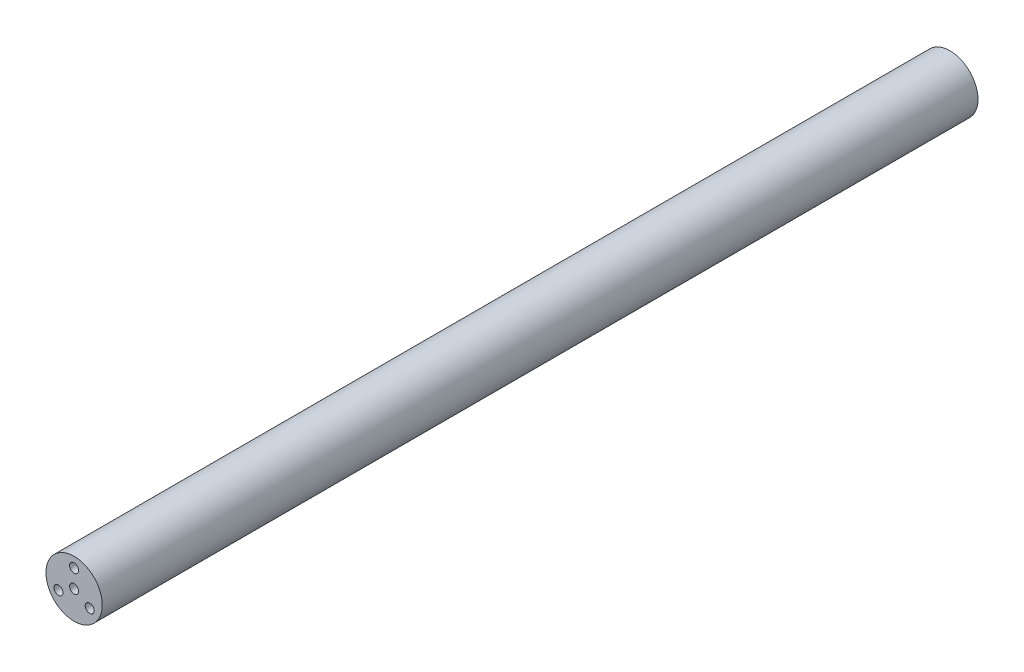
ISO-10303-21;
HEADER;
FILE_DESCRIPTION(('STEP AP214'),'2;1');
FILE_NAME('part.step','',(''),(''),'','','');
FILE_SCHEMA(('AUTOMOTIVE_DESIGN { 1 0 10303 214 1 1 1 1 }'));
ENDSEC;
DATA;
#1=APPLICATION_CONTEXT('core data for automotive mechanical design processes');
#2=APPLICATION_PROTOCOL_DEFINITION('international standard','automotive_design',2000,#1);
#3=PRODUCT_CONTEXT('',#1,'mechanical');
#4=PRODUCT('Part','Part','',(#3));
#5=PRODUCT_RELATED_PRODUCT_CATEGORY('part','',(#4));
#6=PRODUCT_DEFINITION_FORMATION('','',#4);
#7=PRODUCT_DEFINITION_CONTEXT('part definition',#1,'design');
#8=PRODUCT_DEFINITION('design','',#6,#7);
#9=PRODUCT_DEFINITION_SHAPE('','',#8);
#10=(LENGTH_UNIT() NAMED_UNIT(*) SI_UNIT(.MILLI.,.METRE.));
#11=(NAMED_UNIT(*) PLANE_ANGLE_UNIT() SI_UNIT($,.RADIAN.));
#12=(NAMED_UNIT(*) SI_UNIT($,.STERADIAN.) SOLID_ANGLE_UNIT());
#13=UNCERTAINTY_MEASURE_WITH_UNIT(LENGTH_MEASURE(1.E-05),#10,'distance_accuracy_value','');
#14=(GEOMETRIC_REPRESENTATION_CONTEXT(3) GLOBAL_UNCERTAINTY_ASSIGNED_CONTEXT((#13)) GLOBAL_UNIT_ASSIGNED_CONTEXT((#10,
#11,#12)) REPRESENTATION_CONTEXT('',''));
#15=CARTESIAN_POINT('',(0.,0.,0.));
#16=DIRECTION('',(0.,0.,1.));
#17=DIRECTION('',(1.,0.,0.));
#18=AXIS2_PLACEMENT_3D('',#15,#16,#17);
#19=CARTESIAN_POINT('',(-6.92820323027552,-3.99999999999998,-805.5));
#20=DIRECTION('',(0.,0.,1.));
#21=DIRECTION('',(1.,0.,0.));
#22=AXIS2_PLACEMENT_3D('',#19,#20,#21);
#23=CYLINDRICAL_SURFACE('',#22,2.);
#24=CARTESIAN_POINT('',(-6.92820323027552,-3.99999999999998,-194.5));
#25=DIRECTION('',(0.,0.,1.));
#26=DIRECTION('',(1.,0.,0.));
#27=AXIS2_PLACEMENT_3D('',#24,#25,#26);
#28=CIRCLE('',#27,2.);
#29=CARTESIAN_POINT('',(-4.92820323027552,-3.99999999999998,-194.5));
#30=VERTEX_POINT('',#29);
#31=EDGE_CURVE('E207',#30,#30,#28,.T.);
#32=ORIENTED_EDGE('',*,*,#31,.F.);
#33=EDGE_LOOP('',(#32));
#34=FACE_BOUND('',#33,.T.);
#35=CARTESIAN_POINT('',(-6.92820323027552,-3.99999999999998,-146.5));
#36=DIRECTION('',(0.,0.,1.));
#37=DIRECTION('',(1.,0.,0.));
#38=AXIS2_PLACEMENT_3D('',#35,#36,#37);
#39=CIRCLE('',#38,2.);
#40=CARTESIAN_POINT('',(-5.71954013768019,-5.59346588560843,-146.5));
#41=VERTEX_POINT('',#40);
#42=CARTESIAN_POINT('',(-7.70385362097863,-2.15653411439154,-146.5));
#43=VERTEX_POINT('',#42);
#44=EDGE_CURVE('E226',#41,#43,#39,.F.);
#45=ORIENTED_EDGE('',*,*,#44,.F.);
#46=DIRECTION('',(0.,0.,1.));
#47=VECTOR('',#46,1.);
#48=CARTESIAN_POINT('',(-5.71954013768019,-5.59346588560843,-305.5));
#49=LINE('',#48,#47);
#50=CARTESIAN_POINT('',(-5.71954013768019,-5.59346588560843,-154.5));
#51=VERTEX_POINT('',#50);
#52=EDGE_CURVE('E162',#51,#41,#49,.T.);
#53=ORIENTED_EDGE('',*,*,#52,.F.);
#54=CARTESIAN_POINT('',(-6.92820323027552,-3.99999999999998,-154.5));
#55=DIRECTION('',(0.,0.,1.));
#56=DIRECTION('',(1.,0.,0.));
#57=AXIS2_PLACEMENT_3D('',#54,#55,#56);
#58=CIRCLE('',#57,2.);
#59=CARTESIAN_POINT('',(-7.70385362097863,-2.15653411439154,-154.5));
#60=VERTEX_POINT('',#59);
#61=EDGE_CURVE('E213',#51,#60,#58,.T.);
#62=ORIENTED_EDGE('',*,*,#61,.T.);
#63=DIRECTION('',(0.,0.,1.));
#64=VECTOR('',#63,1.);
#65=CARTESIAN_POINT('',(-7.70385362097863,-2.15653411439154,-305.5));
#66=LINE('',#65,#64);
#67=EDGE_CURVE('E169',#43,#60,#66,.F.);
#68=ORIENTED_EDGE('',*,*,#67,.F.);
#69=EDGE_LOOP('',(#45,#53,#62,#68));
#70=FACE_BOUND('',#69,.T.);
#71=ADVANCED_FACE('F40',(#34,#70),#23,.F.);
#72=CARTESIAN_POINT('',(6.92820323027552,-3.99999999999998,-805.5));
#73=DIRECTION('',(0.,0.,1.));
#74=DIRECTION('',(1.,0.,0.));
#75=AXIS2_PLACEMENT_3D('',#72,#73,#74);
#76=CYLINDRICAL_SURFACE('',#75,2.);
#77=CARTESIAN_POINT('',(6.92820323027552,-3.99999999999998,-194.5));
#78=DIRECTION('',(0.,0.,1.));
#79=DIRECTION('',(1.,0.,0.));
#80=AXIS2_PLACEMENT_3D('',#77,#78,#79);
#81=CIRCLE('',#80,2.);
#82=CARTESIAN_POINT('',(8.92820323027552,-3.99999999999998,-194.5));
#83=VERTEX_POINT('',#82);
#84=EDGE_CURVE('E198',#83,#83,#81,.T.);
#85=ORIENTED_EDGE('',*,*,#84,.F.);
#86=EDGE_LOOP('',(#85));
#87=FACE_BOUND('',#86,.T.);
#88=CARTESIAN_POINT('',(6.92820323027552,-3.99999999999998,-146.5));
#89=DIRECTION('',(0.,0.,1.));
#90=DIRECTION('',(1.,0.,0.));
#91=AXIS2_PLACEMENT_3D('',#88,#89,#90);
#92=CIRCLE('',#91,2.);
#93=CARTESIAN_POINT('',(7.70385362097863,-2.15653411439154,-146.5));
#94=VERTEX_POINT('',#93);
#95=CARTESIAN_POINT('',(5.71954013768019,-5.59346588560842,-146.5));
#96=VERTEX_POINT('',#95);
#97=EDGE_CURVE('E63',#94,#96,#92,.F.);
#98=ORIENTED_EDGE('',*,*,#97,.F.);
#99=DIRECTION('',(0.,0.,1.));
#100=VECTOR('',#99,1.);
#101=CARTESIAN_POINT('',(7.70385362097863,-2.15653411439154,-305.5));
#102=LINE('',#101,#100);
#103=CARTESIAN_POINT('',(7.70385362097863,-2.15653411439154,-154.5));
#104=VERTEX_POINT('',#103);
#105=EDGE_CURVE('E154',#104,#94,#102,.T.);
#106=ORIENTED_EDGE('',*,*,#105,.F.);
#107=CARTESIAN_POINT('',(6.92820323027552,-3.99999999999998,-154.5));
#108=DIRECTION('',(0.,0.,1.));
#109=DIRECTION('',(1.,0.,0.));
#110=AXIS2_PLACEMENT_3D('',#107,#108,#109);
#111=CIRCLE('',#110,2.);
#112=CARTESIAN_POINT('',(5.71954013768019,-5.59346588560842,-154.5));
#113=VERTEX_POINT('',#112);
#114=EDGE_CURVE('E204',#104,#113,#111,.T.);
#115=ORIENTED_EDGE('',*,*,#114,.T.);
#116=DIRECTION('',(0.,0.,1.));
#117=VECTOR('',#116,1.);
#118=CARTESIAN_POINT('',(5.7195401376802,-5.59346588560842,-305.5));
#119=LINE('',#118,#117);
#120=EDGE_CURVE('E161',#96,#113,#119,.F.);
#121=ORIENTED_EDGE('',*,*,#120,.F.);
#122=EDGE_LOOP('',(#98,#106,#115,#121));
#123=FACE_BOUND('',#122,.T.);
#124=ADVANCED_FACE('F276',(#87,#123),#76,.F.);
#125=CARTESIAN_POINT('',(0.,8.,-805.5));
#126=DIRECTION('',(0.,0.,1.));
#127=DIRECTION('',(1.,0.,0.));
#128=AXIS2_PLACEMENT_3D('',#125,#126,#127);
#129=CYLINDRICAL_SURFACE('',#128,2.);
#130=CARTESIAN_POINT('',(0.,8.,-194.5));
#131=DIRECTION('',(0.,0.,1.));
#132=DIRECTION('',(1.,0.,0.));
#133=AXIS2_PLACEMENT_3D('',#130,#131,#132);
#134=CIRCLE('',#133,2.);
#135=CARTESIAN_POINT('',(2.,8.,-194.5));
#136=VERTEX_POINT('',#135);
#137=EDGE_CURVE('E190',#136,#136,#134,.T.);
#138=ORIENTED_EDGE('',*,*,#137,.F.);
#139=EDGE_LOOP('',(#138));
#140=FACE_BOUND('',#139,.T.);
#141=CARTESIAN_POINT('',(0.,8.,-146.5));
#142=DIRECTION('',(0.,0.,1.));
#143=DIRECTION('',(1.,0.,0.));
#144=AXIS2_PLACEMENT_3D('',#141,#142,#143);
#145=CIRCLE('',#144,2.);
#146=CARTESIAN_POINT('',(-1.98431348329844,7.75,-146.5));
#147=VERTEX_POINT('',#146);
#148=CARTESIAN_POINT('',(1.98431348329844,7.75,-146.5));
#149=VERTEX_POINT('',#148);
#150=EDGE_CURVE('E56',#147,#149,#145,.F.);
#151=ORIENTED_EDGE('',*,*,#150,.F.);
#152=DIRECTION('',(0.,0.,1.));
#153=VECTOR('',#152,1.);
#154=CARTESIAN_POINT('',(-1.98431348329844,7.75,-305.5));
#155=LINE('',#154,#153);
#156=CARTESIAN_POINT('',(-1.98431348329844,7.75,-154.5));
#157=VERTEX_POINT('',#156);
#158=EDGE_CURVE('E13',#157,#147,#155,.T.);
#159=ORIENTED_EDGE('',*,*,#158,.F.);
#160=CARTESIAN_POINT('',(0.,8.,-154.5));
#161=DIRECTION('',(0.,0.,1.));
#162=DIRECTION('',(1.,0.,0.));
#163=AXIS2_PLACEMENT_3D('',#160,#161,#162);
#164=CIRCLE('',#163,2.);
#165=CARTESIAN_POINT('',(1.98431348329844,7.75,-154.5));
#166=VERTEX_POINT('',#165);
#167=EDGE_CURVE('E195',#157,#166,#164,.T.);
#168=ORIENTED_EDGE('',*,*,#167,.T.);
#169=DIRECTION('',(0.,0.,1.));
#170=VECTOR('',#169,1.);
#171=CARTESIAN_POINT('',(1.98431348329844,7.75,-305.5));
#172=LINE('',#171,#170);
#173=EDGE_CURVE('E152',#149,#166,#172,.F.);
#174=ORIENTED_EDGE('',*,*,#173,.F.);
#175=EDGE_LOOP('',(#151,#159,#168,#174));
#176=FACE_BOUND('',#175,.T.);
#177=ADVANCED_FACE('F282',(#140,#176),#129,.F.);
#178=CARTESIAN_POINT('',(0.,0.,194.5));
#179=DIRECTION('',(0.,0.,-1.));
#180=DIRECTION('',(-1.,0.,0.));
#181=AXIS2_PLACEMENT_3D('',#178,#179,#180);
#182=CYLINDRICAL_SURFACE('',#181,12.5);
#183=CARTESIAN_POINT('',(0.,0.,194.5));
#184=DIRECTION('',(0.,0.,1.));
#185=DIRECTION('',(1.,0.,0.));
#186=AXIS2_PLACEMENT_3D('',#183,#184,#185);
#187=CIRCLE('',#186,12.5);
#188=CARTESIAN_POINT('',(12.5,0.,194.5));
#189=VERTEX_POINT('',#188);
#190=EDGE_CURVE('E172',#189,#189,#187,.T.);
#191=ORIENTED_EDGE('',*,*,#190,.F.);
#192=EDGE_LOOP('',(#191));
#193=FACE_BOUND('',#192,.T.);
#194=CARTESIAN_POINT('',(0.,0.,-194.5));
#195=DIRECTION('',(0.,0.,1.));
#196=DIRECTION('',(1.,0.,0.));
#197=AXIS2_PLACEMENT_3D('',#194,#195,#196);
#198=CIRCLE('',#197,12.5);
#199=CARTESIAN_POINT('',(12.5,0.,-194.5));
#200=VERTEX_POINT('',#199);
#201=EDGE_CURVE('E174',#200,#200,#198,.T.);
#202=ORIENTED_EDGE('',*,*,#201,.T.);
#203=EDGE_LOOP('',(#202));
#204=FACE_BOUND('',#203,.T.);
#205=ADVANCED_FACE('F42',(#193,#204),#182,.T.);
#206=CARTESIAN_POINT('',(0.,0.,194.5));
#207=DIRECTION('',(0.,0.,1.));
#208=DIRECTION('',(1.,0.,0.));
#209=AXIS2_PLACEMENT_3D('',#206,#207,#208);
#210=PLANE('',#209);
#211=CARTESIAN_POINT('',(0.,8.,194.5));
#212=DIRECTION('',(0.,0.,1.));
#213=DIRECTION('',(1.,0.,0.));
#214=AXIS2_PLACEMENT_3D('',#211,#212,#213);
#215=CIRCLE('',#214,2.);
#216=CARTESIAN_POINT('',(2.,8.,194.5));
#217=VERTEX_POINT('',#216);
#218=EDGE_CURVE('E216',#217,#217,#215,.T.);
#219=ORIENTED_EDGE('',*,*,#218,.F.);
#220=EDGE_LOOP('',(#219));
#221=FACE_BOUND('',#220,.T.);
#222=CARTESIAN_POINT('',(0.,0.,194.5));
#223=DIRECTION('',(0.,0.,1.));
#224=DIRECTION('',(1.,0.,0.));
#225=AXIS2_PLACEMENT_3D('',#222,#223,#224);
#226=CIRCLE('',#225,2.);
#227=CARTESIAN_POINT('',(2.,0.,194.5));
#228=VERTEX_POINT('',#227);
#229=EDGE_CURVE('E221',#228,#228,#226,.T.);
#230=ORIENTED_EDGE('',*,*,#229,.F.);
#231=EDGE_LOOP('',(#230));
#232=FACE_BOUND('',#231,.T.);
#233=CARTESIAN_POINT('',(6.92820323027552,-3.99999999999998,194.5));
#234=DIRECTION('',(0.,0.,1.));
#235=DIRECTION('',(1.,0.,0.));
#236=AXIS2_PLACEMENT_3D('',#233,#234,#235);
#237=CIRCLE('',#236,2.);
#238=CARTESIAN_POINT('',(8.92820323027552,-3.99999999999998,194.5));
#239=VERTEX_POINT('',#238);
#240=EDGE_CURVE('E217',#239,#239,#237,.T.);
#241=ORIENTED_EDGE('',*,*,#240,.F.);
#242=EDGE_LOOP('',(#241));
#243=FACE_BOUND('',#242,.T.);
#244=CARTESIAN_POINT('',(-6.92820323027552,-3.99999999999998,194.5));
#245=DIRECTION('',(0.,0.,1.));
#246=DIRECTION('',(1.,0.,0.));
#247=AXIS2_PLACEMENT_3D('',#244,#245,#246);
#248=CIRCLE('',#247,2.);
#249=CARTESIAN_POINT('',(-4.92820323027552,-3.99999999999998,194.5));
#250=VERTEX_POINT('',#249);
#251=EDGE_CURVE('E220',#250,#250,#248,.T.);
#252=ORIENTED_EDGE('',*,*,#251,.F.);
#253=EDGE_LOOP('',(#252));
#254=FACE_BOUND('',#253,.T.);
#255=ORIENTED_EDGE('',*,*,#190,.T.);
#256=EDGE_LOOP('',(#255));
#257=FACE_BOUND('',#256,.T.);
#258=ADVANCED_FACE('F294',(#221,#232,#243,#254,#257),#210,.T.);
#259=CARTESIAN_POINT('',(0.,0.,-194.5));
#260=DIRECTION('',(0.,0.,1.));
#261=DIRECTION('',(1.,0.,0.));
#262=AXIS2_PLACEMENT_3D('',#259,#260,#261);
#263=PLANE('',#262);
#264=ORIENTED_EDGE('',*,*,#137,.T.);
#265=EDGE_LOOP('',(#264));
#266=FACE_BOUND('',#265,.T.);
#267=CARTESIAN_POINT('',(0.,0.,-194.5));
#268=DIRECTION('',(0.,0.,1.));
#269=DIRECTION('',(1.,0.,0.));
#270=AXIS2_PLACEMENT_3D('',#267,#268,#269);
#271=CIRCLE('',#270,2.);
#272=CARTESIAN_POINT('',(2.,0.,-194.5));
#273=VERTEX_POINT('',#272);
#274=EDGE_CURVE('E184',#273,#273,#271,.T.);
#275=ORIENTED_EDGE('',*,*,#274,.T.);
#276=EDGE_LOOP('',(#275));
#277=FACE_BOUND('',#276,.T.);
#278=ORIENTED_EDGE('',*,*,#84,.T.);
#279=EDGE_LOOP('',(#278));
#280=FACE_BOUND('',#279,.T.);
#281=ORIENTED_EDGE('',*,*,#31,.T.);
#282=EDGE_LOOP('',(#281));
#283=FACE_BOUND('',#282,.T.);
#284=ORIENTED_EDGE('',*,*,#201,.F.);
#285=EDGE_LOOP('',(#284));
#286=FACE_BOUND('',#285,.T.);
#287=ADVANCED_FACE('F289',(#266,#277,#280,#283,#286),#263,.F.);
#288=CARTESIAN_POINT('',(-5.71954013768019,-5.59346588560843,146.5));
#289=VERTEX_POINT('',#288);
#290=CARTESIAN_POINT('',(-5.71954013768019,-5.59346588560843,154.5));
#291=VERTEX_POINT('',#290);
#292=EDGE_CURVE('E165',#289,#291,#49,.T.);
#293=ORIENTED_EDGE('',*,*,#292,.F.);
#294=CARTESIAN_POINT('',(-6.92820323027552,-3.99999999999998,146.5));
#295=DIRECTION('',(0.,0.,1.));
#296=DIRECTION('',(1.,0.,0.));
#297=AXIS2_PLACEMENT_3D('',#294,#295,#296);
#298=CIRCLE('',#297,2.);
#299=CARTESIAN_POINT('',(-7.70385362097863,-2.15653411439154,146.5));
#300=VERTEX_POINT('',#299);
#301=EDGE_CURVE('E238',#289,#300,#298,.F.);
#302=ORIENTED_EDGE('',*,*,#301,.T.);
#303=CARTESIAN_POINT('',(-7.70385362097863,-2.15653411439154,154.5));
#304=VERTEX_POINT('',#303);
#305=EDGE_CURVE('E166',#304,#300,#66,.F.);
#306=ORIENTED_EDGE('',*,*,#305,.F.);
#307=CARTESIAN_POINT('',(-6.92820323027552,-3.99999999999998,154.5));
#308=DIRECTION('',(0.,0.,1.));
#309=DIRECTION('',(1.,0.,0.));
#310=AXIS2_PLACEMENT_3D('',#307,#308,#309);
#311=CIRCLE('',#310,2.);
#312=EDGE_CURVE('E210',#291,#304,#311,.T.);
#313=ORIENTED_EDGE('',*,*,#312,.F.);
#314=EDGE_LOOP('',(#293,#302,#306,#313));
#315=FACE_BOUND('',#314,.T.);
#316=ORIENTED_EDGE('',*,*,#251,.T.);
#317=EDGE_LOOP('',(#316));
#318=FACE_BOUND('',#317,.T.);
#319=ADVANCED_FACE('F258',(#315,#318),#23,.F.);
#320=CARTESIAN_POINT('',(7.70385362097863,-2.15653411439154,146.5));
#321=VERTEX_POINT('',#320);
#322=CARTESIAN_POINT('',(7.70385362097863,-2.15653411439154,154.5));
#323=VERTEX_POINT('',#322);
#324=EDGE_CURVE('E157',#321,#323,#102,.T.);
#325=ORIENTED_EDGE('',*,*,#324,.F.);
#326=CARTESIAN_POINT('',(6.92820323027552,-3.99999999999998,146.5));
#327=DIRECTION('',(0.,0.,1.));
#328=DIRECTION('',(1.,0.,0.));
#329=AXIS2_PLACEMENT_3D('',#326,#327,#328);
#330=CIRCLE('',#329,2.);
#331=CARTESIAN_POINT('',(5.71954013768019,-5.59346588560842,146.5));
#332=VERTEX_POINT('',#331);
#333=EDGE_CURVE('E144',#321,#332,#330,.F.);
#334=ORIENTED_EDGE('',*,*,#333,.T.);
#335=CARTESIAN_POINT('',(5.71954013768019,-5.59346588560842,154.5));
#336=VERTEX_POINT('',#335);
#337=EDGE_CURVE('E158',#336,#332,#119,.F.);
#338=ORIENTED_EDGE('',*,*,#337,.F.);
#339=CARTESIAN_POINT('',(6.92820323027552,-3.99999999999998,154.5));
#340=DIRECTION('',(0.,0.,1.));
#341=DIRECTION('',(1.,0.,0.));
#342=AXIS2_PLACEMENT_3D('',#339,#340,#341);
#343=CIRCLE('',#342,2.);
#344=EDGE_CURVE('E201',#323,#336,#343,.T.);
#345=ORIENTED_EDGE('',*,*,#344,.F.);
#346=EDGE_LOOP('',(#325,#334,#338,#345));
#347=FACE_BOUND('',#346,.T.);
#348=ORIENTED_EDGE('',*,*,#240,.T.);
#349=EDGE_LOOP('',(#348));
#350=FACE_BOUND('',#349,.T.);
#351=ADVANCED_FACE('F244',(#347,#350),#76,.F.);
#352=CARTESIAN_POINT('',(-1.98431348329844,7.75,146.5));
#353=VERTEX_POINT('',#352);
#354=CARTESIAN_POINT('',(-1.98431348329844,7.75,154.5));
#355=VERTEX_POINT('',#354);
#356=EDGE_CURVE('E49',#353,#355,#155,.T.);
#357=ORIENTED_EDGE('',*,*,#356,.F.);
#358=CARTESIAN_POINT('',(0.,8.,146.5));
#359=DIRECTION('',(0.,0.,1.));
#360=DIRECTION('',(1.,0.,0.));
#361=AXIS2_PLACEMENT_3D('',#358,#359,#360);
#362=CIRCLE('',#361,2.);
#363=CARTESIAN_POINT('',(1.98431348329844,7.75,146.5));
#364=VERTEX_POINT('',#363);
#365=EDGE_CURVE('E131',#353,#364,#362,.F.);
#366=ORIENTED_EDGE('',*,*,#365,.T.);
#367=CARTESIAN_POINT('',(1.98431348329844,7.75,154.5));
#368=VERTEX_POINT('',#367);
#369=EDGE_CURVE('E142',#368,#364,#172,.F.);
#370=ORIENTED_EDGE('',*,*,#369,.F.);
#371=CARTESIAN_POINT('',(0.,8.,154.5));
#372=DIRECTION('',(0.,0.,1.));
#373=DIRECTION('',(1.,0.,0.));
#374=AXIS2_PLACEMENT_3D('',#371,#372,#373);
#375=CIRCLE('',#374,2.);
#376=EDGE_CURVE('E193',#355,#368,#375,.T.);
#377=ORIENTED_EDGE('',*,*,#376,.F.);
#378=EDGE_LOOP('',(#357,#366,#370,#377));
#379=FACE_BOUND('',#378,.T.);
#380=ORIENTED_EDGE('',*,*,#218,.T.);
#381=EDGE_LOOP('',(#380));
#382=FACE_BOUND('',#381,.T.);
#383=ADVANCED_FACE('F139',(#379,#382),#129,.F.);
#384=CARTESIAN_POINT('',(0.,0.,-805.5));
#385=DIRECTION('',(0.,0.,1.));
#386=DIRECTION('',(1.,0.,0.));
#387=AXIS2_PLACEMENT_3D('',#384,#385,#386);
#388=CYLINDRICAL_SURFACE('',#387,2.);
#389=CARTESIAN_POINT('',(0.,0.,-154.5));
#390=DIRECTION('',(0.,0.,1.));
#391=DIRECTION('',(1.,0.,0.));
#392=AXIS2_PLACEMENT_3D('',#389,#390,#391);
#393=CIRCLE('',#392,2.);
#394=CARTESIAN_POINT('',(2.,0.,-154.5));
#395=VERTEX_POINT('',#394);
#396=EDGE_CURVE('E44',#395,#395,#393,.T.);
#397=ORIENTED_EDGE('',*,*,#396,.T.);
#398=EDGE_LOOP('',(#397));
#399=FACE_BOUND('',#398,.T.);
#400=ORIENTED_EDGE('',*,*,#274,.F.);
#401=EDGE_LOOP('',(#400));
#402=FACE_BOUND('',#401,.T.);
#403=ADVANCED_FACE('F315',(#399,#402),#388,.F.);
#404=ORIENTED_EDGE('',*,*,#229,.T.);
#405=EDGE_LOOP('',(#404));
#406=FACE_BOUND('',#405,.T.);
#407=CARTESIAN_POINT('',(0.,0.,154.5));
#408=DIRECTION('',(0.,0.,1.));
#409=DIRECTION('',(1.,0.,0.));
#410=AXIS2_PLACEMENT_3D('',#407,#408,#409);
#411=CIRCLE('',#410,2.);
#412=CARTESIAN_POINT('',(2.,0.,154.5));
#413=VERTEX_POINT('',#412);
#414=EDGE_CURVE('E187',#413,#413,#411,.T.);
#415=ORIENTED_EDGE('',*,*,#414,.F.);
#416=EDGE_LOOP('',(#415));
#417=FACE_BOUND('',#416,.T.);
#418=ADVANCED_FACE('F310',(#406,#417),#388,.F.);
#419=CARTESIAN_POINT('',(0.,0.,154.5));
#420=DIRECTION('',(0.,0.,1.));
#421=DIRECTION('',(1.,0.,0.));
#422=AXIS2_PLACEMENT_3D('',#419,#420,#421);
#423=PLANE('',#422);
#424=ORIENTED_EDGE('',*,*,#414,.T.);
#425=EDGE_LOOP('',(#424));
#426=FACE_BOUND('',#425,.T.);
#427=CARTESIAN_POINT('',(0.,0.,154.5));
#428=DIRECTION('',(0.,0.,1.));
#429=DIRECTION('',(1.,0.,0.));
#430=AXIS2_PLACEMENT_3D('',#427,#428,#429);
#431=CIRCLE('',#430,8.);
#432=EDGE_CURVE('E171',#304,#355,#431,.F.);
#433=ORIENTED_EDGE('',*,*,#432,.T.);
#434=ORIENTED_EDGE('',*,*,#376,.T.);
#435=EDGE_CURVE('E151',#368,#323,#431,.F.);
#436=ORIENTED_EDGE('',*,*,#435,.T.);
#437=ORIENTED_EDGE('',*,*,#344,.T.);
#438=EDGE_CURVE('E173',#336,#291,#431,.F.);
#439=ORIENTED_EDGE('',*,*,#438,.T.);
#440=ORIENTED_EDGE('',*,*,#312,.T.);
#441=EDGE_LOOP('',(#433,#434,#436,#437,#439,#440));
#442=FACE_BOUND('',#441,.T.);
#443=ADVANCED_FACE('F256',(#426,#442),#423,.F.);
#444=CARTESIAN_POINT('',(0.,0.,-154.5));
#445=DIRECTION('',(0.,0.,1.));
#446=DIRECTION('',(1.,0.,0.));
#447=AXIS2_PLACEMENT_3D('',#444,#445,#446);
#448=PLANE('',#447);
#449=ORIENTED_EDGE('',*,*,#167,.F.);
#450=CARTESIAN_POINT('',(0.,0.,-154.5));
#451=DIRECTION('',(0.,0.,1.));
#452=DIRECTION('',(1.,0.,0.));
#453=AXIS2_PLACEMENT_3D('',#450,#451,#452);
#454=CIRCLE('',#453,8.);
#455=EDGE_CURVE('E183',#60,#157,#454,.F.);
#456=ORIENTED_EDGE('',*,*,#455,.F.);
#457=ORIENTED_EDGE('',*,*,#61,.F.);
#458=EDGE_CURVE('E177',#113,#51,#454,.F.);
#459=ORIENTED_EDGE('',*,*,#458,.F.);
#460=ORIENTED_EDGE('',*,*,#114,.F.);
#461=EDGE_CURVE('E180',#166,#104,#454,.F.);
#462=ORIENTED_EDGE('',*,*,#461,.F.);
#463=EDGE_LOOP('',(#449,#456,#457,#459,#460,#462));
#464=FACE_BOUND('',#463,.T.);
#465=ORIENTED_EDGE('',*,*,#396,.F.);
#466=EDGE_LOOP('',(#465));
#467=FACE_BOUND('',#466,.T.);
#468=ADVANCED_FACE('F305',(#464,#467),#448,.T.);
#469=CARTESIAN_POINT('',(0.,0.,-217.12741699797));
#470=DIRECTION('',(0.,0.,1.));
#471=DIRECTION('',(1.,0.,0.));
#472=AXIS2_PLACEMENT_3D('',#469,#470,#471);
#473=CYLINDRICAL_SURFACE('',#472,8.);
#474=CARTESIAN_POINT('',(0.,0.,146.5));
#475=DIRECTION('',(0.,0.,1.));
#476=DIRECTION('',(1.,0.,0.));
#477=AXIS2_PLACEMENT_3D('',#474,#475,#476);
#478=CIRCLE('',#477,8.);
#479=EDGE_CURVE('E135',#300,#289,#478,.T.);
#480=ORIENTED_EDGE('',*,*,#479,.T.);
#481=ORIENTED_EDGE('',*,*,#292,.T.);
#482=ORIENTED_EDGE('',*,*,#438,.F.);
#483=ORIENTED_EDGE('',*,*,#337,.T.);
#484=EDGE_CURVE('E137',#332,#321,#478,.T.);
#485=ORIENTED_EDGE('',*,*,#484,.T.);
#486=ORIENTED_EDGE('',*,*,#324,.T.);
#487=ORIENTED_EDGE('',*,*,#435,.F.);
#488=ORIENTED_EDGE('',*,*,#369,.T.);
#489=EDGE_CURVE('E128',#364,#353,#478,.T.);
#490=ORIENTED_EDGE('',*,*,#489,.T.);
#491=ORIENTED_EDGE('',*,*,#356,.T.);
#492=ORIENTED_EDGE('',*,*,#432,.F.);
#493=ORIENTED_EDGE('',*,*,#305,.T.);
#494=EDGE_LOOP('',(#480,#481,#482,#483,#485,#486,#487,#488,#490,#491,#492,#493));
#495=FACE_BOUND('',#494,.T.);
#496=CARTESIAN_POINT('',(0.,0.,-146.5));
#497=DIRECTION('',(0.,0.,1.));
#498=DIRECTION('',(1.,0.,0.));
#499=AXIS2_PLACEMENT_3D('',#496,#497,#498);
#500=CIRCLE('',#499,8.);
#501=EDGE_CURVE('E236',#41,#43,#500,.F.);
#502=ORIENTED_EDGE('',*,*,#501,.T.);
#503=ORIENTED_EDGE('',*,*,#67,.T.);
#504=ORIENTED_EDGE('',*,*,#455,.T.);
#505=ORIENTED_EDGE('',*,*,#158,.T.);
#506=EDGE_CURVE('E237',#147,#149,#500,.F.);
#507=ORIENTED_EDGE('',*,*,#506,.T.);
#508=ORIENTED_EDGE('',*,*,#173,.T.);
#509=ORIENTED_EDGE('',*,*,#461,.T.);
#510=ORIENTED_EDGE('',*,*,#105,.T.);
#511=EDGE_CURVE('E233',#94,#96,#500,.F.);
#512=ORIENTED_EDGE('',*,*,#511,.T.);
#513=ORIENTED_EDGE('',*,*,#120,.T.);
#514=ORIENTED_EDGE('',*,*,#458,.T.);
#515=ORIENTED_EDGE('',*,*,#52,.T.);
#516=EDGE_LOOP('',(#502,#503,#504,#505,#507,#508,#509,#510,#512,#513,#514,#515));
#517=FACE_BOUND('',#516,.T.);
#518=ADVANCED_FACE('F148',(#495,#517),#473,.F.);
#519=CARTESIAN_POINT('',(0.,0.,-146.5));
#520=DIRECTION('',(0.,0.,1.));
#521=DIRECTION('',(1.,0.,0.));
#522=AXIS2_PLACEMENT_3D('',#519,#520,#521);
#523=PLANE('',#522);
#524=ORIENTED_EDGE('',*,*,#506,.F.);
#525=ORIENTED_EDGE('',*,*,#150,.T.);
#526=EDGE_LOOP('',(#524,#525));
#527=FACE_BOUND('',#526,.T.);
#528=ADVANCED_FACE('F273',(#527),#523,.F.);
#529=ORIENTED_EDGE('',*,*,#511,.F.);
#530=ORIENTED_EDGE('',*,*,#97,.T.);
#531=EDGE_LOOP('',(#529,#530));
#532=FACE_BOUND('',#531,.T.);
#533=ADVANCED_FACE('F270',(#532),#523,.F.);
#534=ORIENTED_EDGE('',*,*,#501,.F.);
#535=ORIENTED_EDGE('',*,*,#44,.T.);
#536=EDGE_LOOP('',(#534,#535));
#537=FACE_BOUND('',#536,.T.);
#538=ADVANCED_FACE('F264',(#537),#523,.F.);
#539=CARTESIAN_POINT('',(0.,0.,146.5));
#540=DIRECTION('',(0.,0.,1.));
#541=DIRECTION('',(1.,0.,0.));
#542=AXIS2_PLACEMENT_3D('',#539,#540,#541);
#543=PLANE('',#542);
#544=ORIENTED_EDGE('',*,*,#301,.F.);
#545=ORIENTED_EDGE('',*,*,#479,.F.);
#546=EDGE_LOOP('',(#544,#545));
#547=FACE_BOUND('',#546,.T.);
#548=ADVANCED_FACE('F261',(#547),#543,.T.);
#549=ORIENTED_EDGE('',*,*,#333,.F.);
#550=ORIENTED_EDGE('',*,*,#484,.F.);
#551=EDGE_LOOP('',(#549,#550));
#552=FACE_BOUND('',#551,.T.);
#553=ADVANCED_FACE('F263',(#552),#543,.T.);
#554=ORIENTED_EDGE('',*,*,#365,.F.);
#555=ORIENTED_EDGE('',*,*,#489,.F.);
#556=EDGE_LOOP('',(#554,#555));
#557=FACE_BOUND('',#556,.T.);
#558=ADVANCED_FACE('F130',(#557),#543,.T.);
#559=CLOSED_SHELL('',(#71,#124,#177,#205,#258,#287,#319,#351,#383,#403,#418,#443,#468,#518,#528,
#533,#538,#548,#553,#558));
#560=MANIFOLD_SOLID_BREP('B2',#559);
#561=ADVANCED_BREP_SHAPE_REPRESENTATION('',(#18,#560),#14);
#562=SHAPE_DEFINITION_REPRESENTATION(#9,#561);
ENDSEC;
END-ISO-10303-21;
